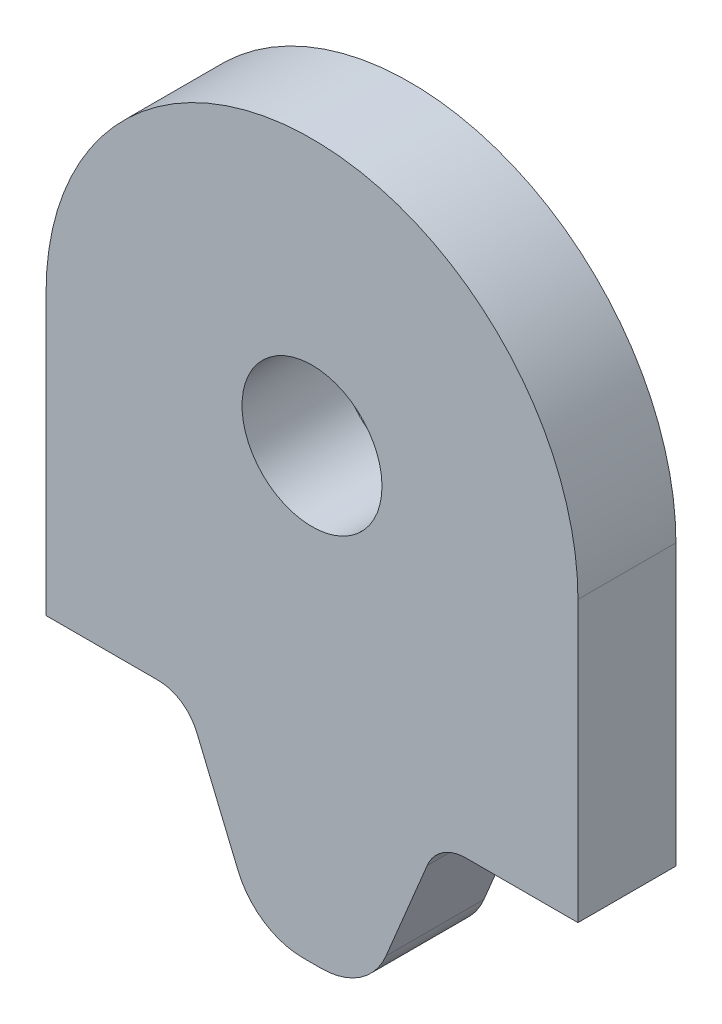
ISO-10303-21;
HEADER;
FILE_DESCRIPTION(('STEP AP214'),'2;1');
FILE_NAME('part.step','',(''),(''),'','','');
FILE_SCHEMA(('AUTOMOTIVE_DESIGN { 1 0 10303 214 1 1 1 1 }'));
ENDSEC;
DATA;
#1=APPLICATION_CONTEXT('core data for automotive mechanical design processes');
#2=APPLICATION_PROTOCOL_DEFINITION('international standard','automotive_design',2000,#1);
#3=PRODUCT_CONTEXT('',#1,'mechanical');
#4=PRODUCT('Part','Part','',(#3));
#5=PRODUCT_RELATED_PRODUCT_CATEGORY('part','',(#4));
#6=PRODUCT_DEFINITION_FORMATION('','',#4);
#7=PRODUCT_DEFINITION_CONTEXT('part definition',#1,'design');
#8=PRODUCT_DEFINITION('design','',#6,#7);
#9=PRODUCT_DEFINITION_SHAPE('','',#8);
#10=(LENGTH_UNIT() NAMED_UNIT(*) SI_UNIT(.MILLI.,.METRE.));
#11=(NAMED_UNIT(*) PLANE_ANGLE_UNIT() SI_UNIT($,.RADIAN.));
#12=(NAMED_UNIT(*) SI_UNIT($,.STERADIAN.) SOLID_ANGLE_UNIT());
#13=UNCERTAINTY_MEASURE_WITH_UNIT(LENGTH_MEASURE(1.E-05),#10,'distance_accuracy_value','');
#14=(GEOMETRIC_REPRESENTATION_CONTEXT(3) GLOBAL_UNCERTAINTY_ASSIGNED_CONTEXT((#13)) GLOBAL_UNIT_ASSIGNED_CONTEXT((#10,
#11,#12)) REPRESENTATION_CONTEXT('',''));
#15=CARTESIAN_POINT('',(0.,0.,0.));
#16=DIRECTION('',(0.,0.,1.));
#17=DIRECTION('',(1.,0.,0.));
#18=AXIS2_PLACEMENT_3D('',#15,#16,#17);
#19=CARTESIAN_POINT('',(0.,0.,7.));
#20=DIRECTION('',(0.,0.,1.));
#21=DIRECTION('',(1.,0.,0.));
#22=AXIS2_PLACEMENT_3D('',#19,#20,#21);
#23=PLANE('',#22);
#24=DIRECTION('',(-0.384615384615385,0.923076923076923,0.));
#25=VECTOR('',#24,1.);
#26=CARTESIAN_POINT('',(-9.,-20.,7.));
#27=LINE('',#26,#25);
#28=CARTESIAN_POINT('',(-5.28205128205128,-28.9230769230769,7.));
#29=VERTEX_POINT('',#28);
#30=CARTESIAN_POINT('',(-8.23076923076923,-21.8461538461538,7.));
#31=VERTEX_POINT('',#30);
#32=EDGE_CURVE('E226',#29,#31,#27,.T.);
#33=ORIENTED_EDGE('',*,*,#32,.F.);
#34=CARTESIAN_POINT('',(-0.666666666666668,-27.,7.));
#35=DIRECTION('',(0.,0.,1.));
#36=DIRECTION('',(1.,0.,0.));
#37=AXIS2_PLACEMENT_3D('',#34,#35,#36);
#38=CIRCLE('',#37,5.);
#39=CARTESIAN_POINT('',(-0.666666666666668,-32.,7.));
#40=VERTEX_POINT('',#39);
#41=EDGE_CURVE('E168',#29,#40,#38,.T.);
#42=ORIENTED_EDGE('',*,*,#41,.T.);
#43=DIRECTION('',(-1.,0.,0.));
#44=VECTOR('',#43,1.);
#45=CARTESIAN_POINT('',(-4.,-32.,7.));
#46=LINE('',#45,#44);
#47=CARTESIAN_POINT('',(0.666666666666685,-32.,7.));
#48=VERTEX_POINT('',#47);
#49=EDGE_CURVE('E220',#48,#40,#46,.T.);
#50=ORIENTED_EDGE('',*,*,#49,.F.);
#51=CARTESIAN_POINT('',(0.666666666666685,-27.,7.));
#52=DIRECTION('',(0.,0.,1.));
#53=DIRECTION('',(1.,0.,0.));
#54=AXIS2_PLACEMENT_3D('',#51,#52,#53);
#55=CIRCLE('',#54,5.);
#56=CARTESIAN_POINT('',(5.2820512820513,-28.9230769230769,7.));
#57=VERTEX_POINT('',#56);
#58=EDGE_CURVE('E165',#48,#57,#55,.T.);
#59=ORIENTED_EDGE('',*,*,#58,.T.);
#60=DIRECTION('',(-0.384615384615384,-0.923076923076923,0.));
#61=VECTOR('',#60,1.);
#62=CARTESIAN_POINT('',(4.00000000000002,-32.,7.));
#63=LINE('',#62,#61);
#64=CARTESIAN_POINT('',(8.23076923076925,-21.8461538461538,7.));
#65=VERTEX_POINT('',#64);
#66=EDGE_CURVE('E215',#65,#57,#63,.T.);
#67=ORIENTED_EDGE('',*,*,#66,.F.);
#68=CARTESIAN_POINT('',(11.,-23.,7.));
#69=DIRECTION('',(0.,0.,1.));
#70=DIRECTION('',(1.,0.,0.));
#71=AXIS2_PLACEMENT_3D('',#68,#69,#70);
#72=CIRCLE('',#71,3.);
#73=CARTESIAN_POINT('',(11.,-20.,7.));
#74=VERTEX_POINT('',#73);
#75=EDGE_CURVE('E190',#65,#74,#72,.F.);
#76=ORIENTED_EDGE('',*,*,#75,.T.);
#77=DIRECTION('',(-1.,0.,0.));
#78=VECTOR('',#77,1.);
#79=CARTESIAN_POINT('',(9.00000000000002,-20.,7.));
#80=LINE('',#79,#78);
#81=CARTESIAN_POINT('',(19.,-20.,7.));
#82=VERTEX_POINT('',#81);
#83=EDGE_CURVE('E213',#82,#74,#80,.T.);
#84=ORIENTED_EDGE('',*,*,#83,.F.);
#85=DIRECTION('',(0.,1.,0.));
#86=VECTOR('',#85,1.);
#87=CARTESIAN_POINT('',(19.,-45.,7.));
#88=LINE('',#87,#86);
#89=CARTESIAN_POINT('',(19.,0.,7.));
#90=VERTEX_POINT('',#89);
#91=EDGE_CURVE('E160',#82,#90,#88,.T.);
#92=ORIENTED_EDGE('',*,*,#91,.T.);
#93=CARTESIAN_POINT('',(0.,0.,7.));
#94=DIRECTION('',(0.,0.,1.));
#95=DIRECTION('',(1.,0.,0.));
#96=AXIS2_PLACEMENT_3D('',#93,#94,#95);
#97=CIRCLE('',#96,19.);
#98=CARTESIAN_POINT('',(-19.,0.,7.));
#99=VERTEX_POINT('',#98);
#100=EDGE_CURVE('E151',#90,#99,#97,.T.);
#101=ORIENTED_EDGE('',*,*,#100,.T.);
#102=DIRECTION('',(0.,-1.,0.));
#103=VECTOR('',#102,1.);
#104=CARTESIAN_POINT('',(-19.,0.,7.));
#105=LINE('',#104,#103);
#106=CARTESIAN_POINT('',(-19.,-20.,7.));
#107=VERTEX_POINT('',#106);
#108=EDGE_CURVE('E236',#99,#107,#105,.T.);
#109=ORIENTED_EDGE('',*,*,#108,.T.);
#110=DIRECTION('',(-1.,0.,0.));
#111=VECTOR('',#110,1.);
#112=CARTESIAN_POINT('',(-19.,-20.,7.));
#113=LINE('',#112,#111);
#114=CARTESIAN_POINT('',(-11.,-20.,7.));
#115=VERTEX_POINT('',#114);
#116=EDGE_CURVE('E139',#115,#107,#113,.T.);
#117=ORIENTED_EDGE('',*,*,#116,.F.);
#118=CARTESIAN_POINT('',(-11.,-23.,7.));
#119=DIRECTION('',(0.,0.,1.));
#120=DIRECTION('',(1.,0.,0.));
#121=AXIS2_PLACEMENT_3D('',#118,#119,#120);
#122=CIRCLE('',#121,3.);
#123=EDGE_CURVE('E41',#115,#31,#122,.F.);
#124=ORIENTED_EDGE('',*,*,#123,.T.);
#125=EDGE_LOOP('',(#33,#42,#50,#59,#67,#76,#84,#92,#101,#109,#117,#124));
#126=FACE_BOUND('',#125,.T.);
#127=CARTESIAN_POINT('',(0.,0.,7.));
#128=DIRECTION('',(0.,0.,1.));
#129=DIRECTION('',(1.,0.,0.));
#130=AXIS2_PLACEMENT_3D('',#127,#128,#129);
#131=CIRCLE('',#130,5.);
#132=CARTESIAN_POINT('',(5.,0.,7.));
#133=VERTEX_POINT('',#132);
#134=EDGE_CURVE('E142',#133,#133,#131,.T.);
#135=ORIENTED_EDGE('',*,*,#134,.F.);
#136=EDGE_LOOP('',(#135));
#137=FACE_BOUND('',#136,.T.);
#138=ADVANCED_FACE('F33',(#126,#137),#23,.T.);
#139=CARTESIAN_POINT('',(0.,0.,0.));
#140=DIRECTION('',(0.,0.,1.));
#141=DIRECTION('',(1.,0.,0.));
#142=AXIS2_PLACEMENT_3D('',#139,#140,#141);
#143=PLANE('',#142);
#144=CARTESIAN_POINT('',(0.,0.,0.));
#145=DIRECTION('',(0.,0.,1.));
#146=DIRECTION('',(1.,0.,0.));
#147=AXIS2_PLACEMENT_3D('',#144,#145,#146);
#148=CIRCLE('',#147,5.);
#149=CARTESIAN_POINT('',(5.,0.,0.));
#150=VERTEX_POINT('',#149);
#151=EDGE_CURVE('E153',#150,#150,#148,.T.);
#152=ORIENTED_EDGE('',*,*,#151,.T.);
#153=EDGE_LOOP('',(#152));
#154=FACE_BOUND('',#153,.T.);
#155=DIRECTION('',(-1.,0.,0.));
#156=VECTOR('',#155,1.);
#157=CARTESIAN_POINT('',(-4.,-32.,0.));
#158=LINE('',#157,#156);
#159=CARTESIAN_POINT('',(0.666666666666685,-32.,0.));
#160=VERTEX_POINT('',#159);
#161=CARTESIAN_POINT('',(-0.666666666666668,-32.,0.));
#162=VERTEX_POINT('',#161);
#163=EDGE_CURVE('E207',#160,#162,#158,.T.);
#164=ORIENTED_EDGE('',*,*,#163,.T.);
#165=CARTESIAN_POINT('',(-0.666666666666668,-27.,0.));
#166=DIRECTION('',(0.,0.,1.));
#167=DIRECTION('',(1.,0.,0.));
#168=AXIS2_PLACEMENT_3D('',#165,#166,#167);
#169=CIRCLE('',#168,5.);
#170=CARTESIAN_POINT('',(-5.28205128205128,-28.9230769230769,0.));
#171=VERTEX_POINT('',#170);
#172=EDGE_CURVE('E177',#162,#171,#169,.F.);
#173=ORIENTED_EDGE('',*,*,#172,.T.);
#174=DIRECTION('',(-0.384615384615385,0.923076923076923,0.));
#175=VECTOR('',#174,1.);
#176=CARTESIAN_POINT('',(-9.,-20.,0.));
#177=LINE('',#176,#175);
#178=CARTESIAN_POINT('',(-8.23076923076923,-21.8461538461538,0.));
#179=VERTEX_POINT('',#178);
#180=EDGE_CURVE('E134',#171,#179,#177,.T.);
#181=ORIENTED_EDGE('',*,*,#180,.T.);
#182=CARTESIAN_POINT('',(-11.,-23.,0.));
#183=DIRECTION('',(0.,0.,1.));
#184=DIRECTION('',(1.,0.,0.));
#185=AXIS2_PLACEMENT_3D('',#182,#183,#184);
#186=CIRCLE('',#185,3.);
#187=CARTESIAN_POINT('',(-11.,-20.,0.));
#188=VERTEX_POINT('',#187);
#189=EDGE_CURVE('E11',#179,#188,#186,.T.);
#190=ORIENTED_EDGE('',*,*,#189,.T.);
#191=DIRECTION('',(-1.,0.,0.));
#192=VECTOR('',#191,1.);
#193=CARTESIAN_POINT('',(-19.,-20.,0.));
#194=LINE('',#193,#192);
#195=CARTESIAN_POINT('',(-19.,-20.,0.));
#196=VERTEX_POINT('',#195);
#197=EDGE_CURVE('E121',#188,#196,#194,.T.);
#198=ORIENTED_EDGE('',*,*,#197,.T.);
#199=DIRECTION('',(0.,-1.,0.));
#200=VECTOR('',#199,1.);
#201=CARTESIAN_POINT('',(-19.,0.,0.));
#202=LINE('',#201,#200);
#203=CARTESIAN_POINT('',(-19.,0.,0.));
#204=VERTEX_POINT('',#203);
#205=EDGE_CURVE('E127',#204,#196,#202,.T.);
#206=ORIENTED_EDGE('',*,*,#205,.F.);
#207=CARTESIAN_POINT('',(0.,0.,0.));
#208=DIRECTION('',(0.,0.,1.));
#209=DIRECTION('',(1.,0.,0.));
#210=AXIS2_PLACEMENT_3D('',#207,#208,#209);
#211=CIRCLE('',#210,19.);
#212=CARTESIAN_POINT('',(19.,0.,0.));
#213=VERTEX_POINT('',#212);
#214=EDGE_CURVE('E149',#213,#204,#211,.T.);
#215=ORIENTED_EDGE('',*,*,#214,.F.);
#216=DIRECTION('',(0.,1.,0.));
#217=VECTOR('',#216,1.);
#218=CARTESIAN_POINT('',(19.,-45.,0.));
#219=LINE('',#218,#217);
#220=CARTESIAN_POINT('',(19.,-20.,0.));
#221=VERTEX_POINT('',#220);
#222=EDGE_CURVE('E148',#221,#213,#219,.T.);
#223=ORIENTED_EDGE('',*,*,#222,.F.);
#224=DIRECTION('',(-1.,0.,0.));
#225=VECTOR('',#224,1.);
#226=CARTESIAN_POINT('',(9.00000000000002,-20.,0.));
#227=LINE('',#226,#225);
#228=CARTESIAN_POINT('',(11.,-20.,0.));
#229=VERTEX_POINT('',#228);
#230=EDGE_CURVE('E198',#221,#229,#227,.T.);
#231=ORIENTED_EDGE('',*,*,#230,.T.);
#232=CARTESIAN_POINT('',(11.,-23.,0.));
#233=DIRECTION('',(0.,0.,1.));
#234=DIRECTION('',(1.,0.,0.));
#235=AXIS2_PLACEMENT_3D('',#232,#233,#234);
#236=CIRCLE('',#235,3.);
#237=CARTESIAN_POINT('',(8.23076923076925,-21.8461538461538,0.));
#238=VERTEX_POINT('',#237);
#239=EDGE_CURVE('E192',#229,#238,#236,.T.);
#240=ORIENTED_EDGE('',*,*,#239,.T.);
#241=DIRECTION('',(-0.384615384615384,-0.923076923076923,0.));
#242=VECTOR('',#241,1.);
#243=CARTESIAN_POINT('',(4.00000000000002,-32.,0.));
#244=LINE('',#243,#242);
#245=CARTESIAN_POINT('',(5.2820512820513,-28.9230769230769,0.));
#246=VERTEX_POINT('',#245);
#247=EDGE_CURVE('E196',#238,#246,#244,.T.);
#248=ORIENTED_EDGE('',*,*,#247,.T.);
#249=CARTESIAN_POINT('',(0.666666666666685,-27.,0.));
#250=DIRECTION('',(0.,0.,1.));
#251=DIRECTION('',(1.,0.,0.));
#252=AXIS2_PLACEMENT_3D('',#249,#250,#251);
#253=CIRCLE('',#252,5.);
#254=EDGE_CURVE('E175',#246,#160,#253,.F.);
#255=ORIENTED_EDGE('',*,*,#254,.T.);
#256=EDGE_LOOP('',(#164,#173,#181,#190,#198,#206,#215,#223,#231,#240,#248,#255));
#257=FACE_BOUND('',#256,.T.);
#258=ADVANCED_FACE('F124',(#154,#257),#143,.F.);
#259=CARTESIAN_POINT('',(0.,0.,7.));
#260=DIRECTION('',(0.,0.,-1.));
#261=DIRECTION('',(-1.,0.,0.));
#262=AXIS2_PLACEMENT_3D('',#259,#260,#261);
#263=CYLINDRICAL_SURFACE('',#262,19.);
#264=ORIENTED_EDGE('',*,*,#214,.T.);
#265=DIRECTION('',(0.,0.,-1.));
#266=VECTOR('',#265,1.);
#267=CARTESIAN_POINT('',(-19.,0.,7.));
#268=LINE('',#267,#266);
#269=EDGE_CURVE('E146',#99,#204,#268,.T.);
#270=ORIENTED_EDGE('',*,*,#269,.F.);
#271=ORIENTED_EDGE('',*,*,#100,.F.);
#272=DIRECTION('',(0.,0.,-1.));
#273=VECTOR('',#272,1.);
#274=CARTESIAN_POINT('',(19.,0.,7.));
#275=LINE('',#274,#273);
#276=EDGE_CURVE('E157',#90,#213,#275,.T.);
#277=ORIENTED_EDGE('',*,*,#276,.T.);
#278=EDGE_LOOP('',(#264,#270,#271,#277));
#279=FACE_BOUND('',#278,.T.);
#280=ADVANCED_FACE('F242',(#279),#263,.T.);
#281=CARTESIAN_POINT('',(-19.,0.,7.));
#282=DIRECTION('',(1.,0.,0.));
#283=DIRECTION('',(0.,1.,0.));
#284=AXIS2_PLACEMENT_3D('',#281,#282,#283);
#285=PLANE('',#284);
#286=ORIENTED_EDGE('',*,*,#205,.T.);
#287=DIRECTION('',(0.,0.,1.));
#288=VECTOR('',#287,1.);
#289=CARTESIAN_POINT('',(-19.,-20.,0.));
#290=LINE('',#289,#288);
#291=EDGE_CURVE('E137',#196,#107,#290,.T.);
#292=ORIENTED_EDGE('',*,*,#291,.T.);
#293=ORIENTED_EDGE('',*,*,#108,.F.);
#294=ORIENTED_EDGE('',*,*,#269,.T.);
#295=EDGE_LOOP('',(#286,#292,#293,#294));
#296=FACE_BOUND('',#295,.T.);
#297=ADVANCED_FACE('F144',(#296),#285,.F.);
#298=CARTESIAN_POINT('',(19.,-45.,7.));
#299=DIRECTION('',(-1.,0.,0.));
#300=DIRECTION('',(0.,0.,1.));
#301=AXIS2_PLACEMENT_3D('',#298,#299,#300);
#302=PLANE('',#301);
#303=ORIENTED_EDGE('',*,*,#91,.F.);
#304=DIRECTION('',(0.,0.,1.));
#305=VECTOR('',#304,1.);
#306=CARTESIAN_POINT('',(19.,-20.,0.));
#307=LINE('',#306,#305);
#308=EDGE_CURVE('E133',#221,#82,#307,.T.);
#309=ORIENTED_EDGE('',*,*,#308,.F.);
#310=ORIENTED_EDGE('',*,*,#222,.T.);
#311=ORIENTED_EDGE('',*,*,#276,.F.);
#312=EDGE_LOOP('',(#303,#309,#310,#311));
#313=FACE_BOUND('',#312,.T.);
#314=ADVANCED_FACE('F240',(#313),#302,.F.);
#315=CARTESIAN_POINT('',(0.,0.,0.));
#316=DIRECTION('',(0.,0.,1.));
#317=DIRECTION('',(1.,0.,0.));
#318=AXIS2_PLACEMENT_3D('',#315,#316,#317);
#319=CYLINDRICAL_SURFACE('',#318,5.);
#320=ORIENTED_EDGE('',*,*,#151,.F.);
#321=EDGE_LOOP('',(#320));
#322=FACE_BOUND('',#321,.T.);
#323=ORIENTED_EDGE('',*,*,#134,.T.);
#324=EDGE_LOOP('',(#323));
#325=FACE_BOUND('',#324,.T.);
#326=ADVANCED_FACE('F258',(#322,#325),#319,.F.);
#327=CARTESIAN_POINT('',(-19.,-20.,0.));
#328=DIRECTION('',(0.,1.,0.));
#329=DIRECTION('',(-1.,0.,0.));
#330=AXIS2_PLACEMENT_3D('',#327,#328,#329);
#331=PLANE('',#330);
#332=ORIENTED_EDGE('',*,*,#197,.F.);
#333=DIRECTION('',(0.,0.,1.));
#334=VECTOR('',#333,1.);
#335=CARTESIAN_POINT('',(-11.,-20.,7.));
#336=LINE('',#335,#334);
#337=EDGE_CURVE('E187',#188,#115,#336,.T.);
#338=ORIENTED_EDGE('',*,*,#337,.T.);
#339=ORIENTED_EDGE('',*,*,#116,.T.);
#340=ORIENTED_EDGE('',*,*,#291,.F.);
#341=EDGE_LOOP('',(#332,#338,#339,#340));
#342=FACE_BOUND('',#341,.T.);
#343=ADVANCED_FACE('F138',(#342),#331,.F.);
#344=CARTESIAN_POINT('',(-9.,-20.,0.));
#345=DIRECTION('',(0.923076923076923,0.384615384615385,0.));
#346=DIRECTION('',(-0.384615384615385,0.923076923076923,0.));
#347=AXIS2_PLACEMENT_3D('',#344,#345,#346);
#348=PLANE('',#347);
#349=ORIENTED_EDGE('',*,*,#32,.T.);
#350=DIRECTION('',(0.,0.,1.));
#351=VECTOR('',#350,1.);
#352=CARTESIAN_POINT('',(-8.23076923076923,-21.8461538461538,0.));
#353=LINE('',#352,#351);
#354=EDGE_CURVE('E54',#31,#179,#353,.F.);
#355=ORIENTED_EDGE('',*,*,#354,.T.);
#356=ORIENTED_EDGE('',*,*,#180,.F.);
#357=DIRECTION('',(0.,0.,1.));
#358=VECTOR('',#357,1.);
#359=CARTESIAN_POINT('',(-5.28205128205128,-28.9230769230769,0.));
#360=LINE('',#359,#358);
#361=EDGE_CURVE('E162',#171,#29,#360,.T.);
#362=ORIENTED_EDGE('',*,*,#361,.T.);
#363=EDGE_LOOP('',(#349,#355,#356,#362));
#364=FACE_BOUND('',#363,.T.);
#365=ADVANCED_FACE('F269',(#364),#348,.F.);
#366=CARTESIAN_POINT('',(-4.,-32.,0.));
#367=DIRECTION('',(0.,1.,0.));
#368=DIRECTION('',(0.,0.,1.));
#369=AXIS2_PLACEMENT_3D('',#366,#367,#368);
#370=PLANE('',#369);
#371=ORIENTED_EDGE('',*,*,#49,.T.);
#372=DIRECTION('',(0.,0.,1.));
#373=VECTOR('',#372,1.);
#374=CARTESIAN_POINT('',(-0.666666666666668,-32.,0.));
#375=LINE('',#374,#373);
#376=EDGE_CURVE('E173',#40,#162,#375,.F.);
#377=ORIENTED_EDGE('',*,*,#376,.T.);
#378=ORIENTED_EDGE('',*,*,#163,.F.);
#379=DIRECTION('',(0.,0.,1.));
#380=VECTOR('',#379,1.);
#381=CARTESIAN_POINT('',(0.666666666666685,-32.,0.));
#382=LINE('',#381,#380);
#383=EDGE_CURVE('E170',#160,#48,#382,.T.);
#384=ORIENTED_EDGE('',*,*,#383,.T.);
#385=EDGE_LOOP('',(#371,#377,#378,#384));
#386=FACE_BOUND('',#385,.T.);
#387=ADVANCED_FACE('F277',(#386),#370,.F.);
#388=CARTESIAN_POINT('',(4.00000000000002,-32.,0.));
#389=DIRECTION('',(-0.923076923076923,0.384615384615384,0.));
#390=DIRECTION('',(-0.384615384615384,-0.923076923076923,0.));
#391=AXIS2_PLACEMENT_3D('',#388,#389,#390);
#392=PLANE('',#391);
#393=ORIENTED_EDGE('',*,*,#247,.F.);
#394=DIRECTION('',(0.,0.,1.));
#395=VECTOR('',#394,1.);
#396=CARTESIAN_POINT('',(8.23076923076925,-21.8461538461538,7.));
#397=LINE('',#396,#395);
#398=EDGE_CURVE('E182',#238,#65,#397,.T.);
#399=ORIENTED_EDGE('',*,*,#398,.T.);
#400=ORIENTED_EDGE('',*,*,#66,.T.);
#401=DIRECTION('',(0.,0.,1.));
#402=VECTOR('',#401,1.);
#403=CARTESIAN_POINT('',(5.2820512820513,-28.9230769230769,0.));
#404=LINE('',#403,#402);
#405=EDGE_CURVE('E179',#57,#246,#404,.F.);
#406=ORIENTED_EDGE('',*,*,#405,.T.);
#407=EDGE_LOOP('',(#393,#399,#400,#406));
#408=FACE_BOUND('',#407,.T.);
#409=ADVANCED_FACE('F203',(#408),#392,.F.);
#410=CARTESIAN_POINT('',(9.00000000000002,-20.,0.));
#411=DIRECTION('',(0.,1.,0.));
#412=DIRECTION('',(-1.,0.,0.));
#413=AXIS2_PLACEMENT_3D('',#410,#411,#412);
#414=PLANE('',#413);
#415=ORIENTED_EDGE('',*,*,#83,.T.);
#416=DIRECTION('',(0.,0.,1.));
#417=VECTOR('',#416,1.);
#418=CARTESIAN_POINT('',(11.,-20.,0.));
#419=LINE('',#418,#417);
#420=EDGE_CURVE('E185',#74,#229,#419,.F.);
#421=ORIENTED_EDGE('',*,*,#420,.T.);
#422=ORIENTED_EDGE('',*,*,#230,.F.);
#423=ORIENTED_EDGE('',*,*,#308,.T.);
#424=EDGE_LOOP('',(#415,#421,#422,#423));
#425=FACE_BOUND('',#424,.T.);
#426=ADVANCED_FACE('F217',(#425),#414,.F.);
#427=CARTESIAN_POINT('',(-0.666666666666668,-27.,0.));
#428=DIRECTION('',(0.,0.,1.));
#429=DIRECTION('',(1.,0.,0.));
#430=AXIS2_PLACEMENT_3D('',#427,#428,#429);
#431=CYLINDRICAL_SURFACE('',#430,5.);
#432=ORIENTED_EDGE('',*,*,#172,.F.);
#433=ORIENTED_EDGE('',*,*,#376,.F.);
#434=ORIENTED_EDGE('',*,*,#41,.F.);
#435=ORIENTED_EDGE('',*,*,#361,.F.);
#436=EDGE_LOOP('',(#432,#433,#434,#435));
#437=FACE_BOUND('',#436,.T.);
#438=ADVANCED_FACE('F285',(#437),#431,.T.);
#439=CARTESIAN_POINT('',(0.666666666666685,-27.,0.));
#440=DIRECTION('',(0.,0.,1.));
#441=DIRECTION('',(1.,0.,0.));
#442=AXIS2_PLACEMENT_3D('',#439,#440,#441);
#443=CYLINDRICAL_SURFACE('',#442,5.);
#444=ORIENTED_EDGE('',*,*,#254,.F.);
#445=ORIENTED_EDGE('',*,*,#405,.F.);
#446=ORIENTED_EDGE('',*,*,#58,.F.);
#447=ORIENTED_EDGE('',*,*,#383,.F.);
#448=EDGE_LOOP('',(#444,#445,#446,#447));
#449=FACE_BOUND('',#448,.T.);
#450=ADVANCED_FACE('F289',(#449),#443,.T.);
#451=CARTESIAN_POINT('',(11.,-23.,0.));
#452=DIRECTION('',(0.,0.,-1.));
#453=DIRECTION('',(-1.,0.,0.));
#454=AXIS2_PLACEMENT_3D('',#451,#452,#453);
#455=CYLINDRICAL_SURFACE('',#454,3.);
#456=ORIENTED_EDGE('',*,*,#239,.F.);
#457=ORIENTED_EDGE('',*,*,#420,.F.);
#458=ORIENTED_EDGE('',*,*,#75,.F.);
#459=ORIENTED_EDGE('',*,*,#398,.F.);
#460=EDGE_LOOP('',(#456,#457,#458,#459));
#461=FACE_BOUND('',#460,.T.);
#462=ADVANCED_FACE('F209',(#461),#455,.F.);
#463=CARTESIAN_POINT('',(-11.,-23.,0.));
#464=DIRECTION('',(0.,0.,-1.));
#465=DIRECTION('',(-1.,0.,0.));
#466=AXIS2_PLACEMENT_3D('',#463,#464,#465);
#467=CYLINDRICAL_SURFACE('',#466,3.);
#468=ORIENTED_EDGE('',*,*,#189,.F.);
#469=ORIENTED_EDGE('',*,*,#354,.F.);
#470=ORIENTED_EDGE('',*,*,#123,.F.);
#471=ORIENTED_EDGE('',*,*,#337,.F.);
#472=EDGE_LOOP('',(#468,#469,#470,#471));
#473=FACE_BOUND('',#472,.T.);
#474=ADVANCED_FACE('F35',(#473),#467,.F.);
#475=CLOSED_SHELL('',(#138,#258,#280,#297,#314,#326,#343,#365,#387,#409,#426,#438,#450,#462,#474));
#476=MANIFOLD_SOLID_BREP('B2',#475);
#477=ADVANCED_BREP_SHAPE_REPRESENTATION('',(#18,#476),#14);
#478=SHAPE_DEFINITION_REPRESENTATION(#9,#477);
ENDSEC;
END-ISO-10303-21;
